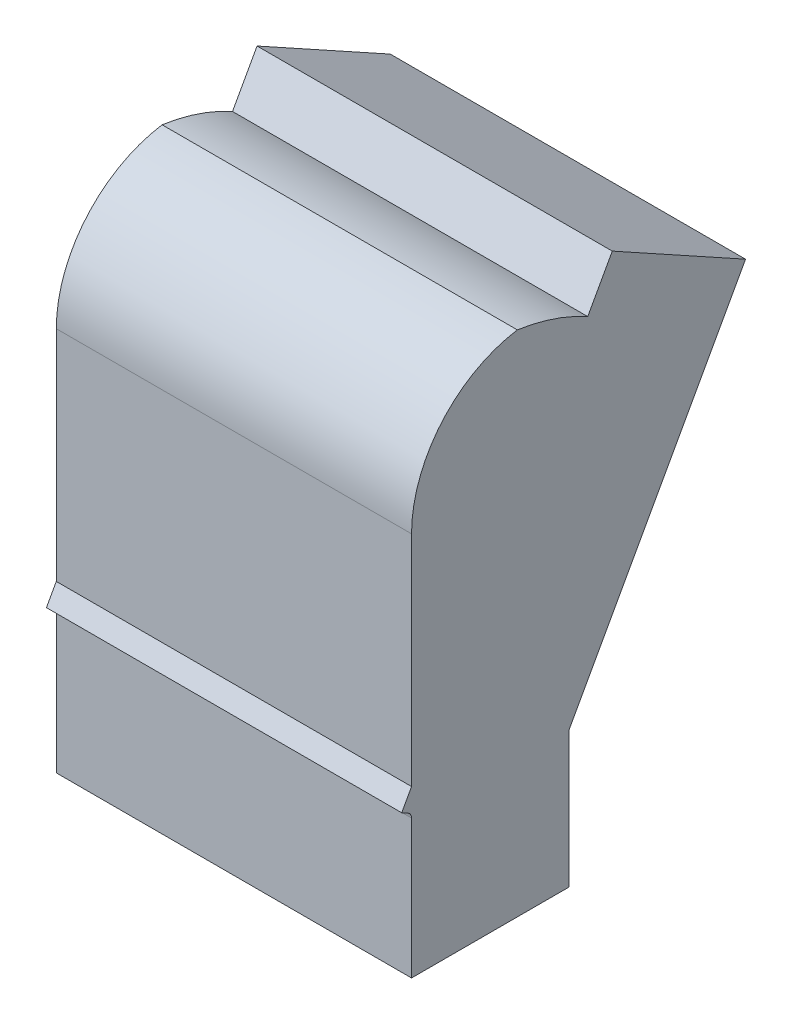
ISO-10303-21;
HEADER;
FILE_DESCRIPTION(('STEP AP214'),'2;1');
FILE_NAME('part.step','',(''),(''),'','','');
FILE_SCHEMA(('AUTOMOTIVE_DESIGN { 1 0 10303 214 1 1 1 1 }'));
ENDSEC;
DATA;
#1=APPLICATION_CONTEXT('core data for automotive mechanical design processes');
#2=APPLICATION_PROTOCOL_DEFINITION('international standard','automotive_design',2000,#1);
#3=PRODUCT_CONTEXT('',#1,'mechanical');
#4=PRODUCT('Part','Part','',(#3));
#5=PRODUCT_RELATED_PRODUCT_CATEGORY('part','',(#4));
#6=PRODUCT_DEFINITION_FORMATION('','',#4);
#7=PRODUCT_DEFINITION_CONTEXT('part definition',#1,'design');
#8=PRODUCT_DEFINITION('design','',#6,#7);
#9=PRODUCT_DEFINITION_SHAPE('','',#8);
#10=(LENGTH_UNIT() NAMED_UNIT(*) SI_UNIT(.MILLI.,.METRE.));
#11=(NAMED_UNIT(*) PLANE_ANGLE_UNIT() SI_UNIT($,.RADIAN.));
#12=(NAMED_UNIT(*) SI_UNIT($,.STERADIAN.) SOLID_ANGLE_UNIT());
#13=UNCERTAINTY_MEASURE_WITH_UNIT(LENGTH_MEASURE(1.E-05),#10,'distance_accuracy_value','');
#14=(GEOMETRIC_REPRESENTATION_CONTEXT(3) GLOBAL_UNCERTAINTY_ASSIGNED_CONTEXT((#13)) GLOBAL_UNIT_ASSIGNED_CONTEXT((#10,
#11,#12)) REPRESENTATION_CONTEXT('',''));
#15=CARTESIAN_POINT('',(0.,0.,0.));
#16=DIRECTION('',(0.,0.,1.));
#17=DIRECTION('',(1.,0.,0.));
#18=AXIS2_PLACEMENT_3D('',#15,#16,#17);
#19=CARTESIAN_POINT('',(177.8,69.342,82.169));
#20=DIRECTION('',(-1.,0.,0.));
#21=DIRECTION('',(0.,0.,1.));
#22=AXIS2_PLACEMENT_3D('',#19,#20,#21);
#23=CYLINDRICAL_SURFACE('',#22,3.429);
#24=CARTESIAN_POINT('',(0.,69.342,82.169));
#25=DIRECTION('',(-1.,0.,0.));
#26=DIRECTION('',(0.,0.,1.));
#27=AXIS2_PLACEMENT_3D('',#24,#25,#26);
#28=CIRCLE('',#27,3.429);
#29=CARTESIAN_POINT('',(0.,72.3433581182661,80.5107206369499));
#30=VERTEX_POINT('',#29);
#31=CARTESIAN_POINT('',(0.,69.342,78.74));
#32=VERTEX_POINT('',#31);
#33=EDGE_CURVE('E149',#30,#32,#28,.T.);
#34=ORIENTED_EDGE('',*,*,#33,.T.);
#35=DIRECTION('',(-1.,0.,0.));
#36=VECTOR('',#35,1.);
#37=CARTESIAN_POINT('',(177.8,69.342,78.74));
#38=LINE('',#37,#36);
#39=CARTESIAN_POINT('',(177.8,69.342,78.74));
#40=VERTEX_POINT('',#39);
#41=EDGE_CURVE('E11',#40,#32,#38,.T.);
#42=ORIENTED_EDGE('',*,*,#41,.F.);
#43=CARTESIAN_POINT('',(177.8,69.342,82.169));
#44=DIRECTION('',(-1.,0.,0.));
#45=DIRECTION('',(0.,0.,1.));
#46=AXIS2_PLACEMENT_3D('',#43,#44,#45);
#47=CIRCLE('',#46,3.429);
#48=CARTESIAN_POINT('',(177.8,72.3433581182661,80.5107206369499));
#49=VERTEX_POINT('',#48);
#50=EDGE_CURVE('E171',#49,#40,#47,.T.);
#51=ORIENTED_EDGE('',*,*,#50,.F.);
#52=DIRECTION('',(-1.,0.,0.));
#53=VECTOR('',#52,1.);
#54=CARTESIAN_POINT('',(177.8,72.3433581182661,80.5107206369499));
#55=LINE('',#54,#53);
#56=EDGE_CURVE('E145',#49,#30,#55,.T.);
#57=ORIENTED_EDGE('',*,*,#56,.T.);
#58=EDGE_LOOP('',(#34,#42,#51,#57));
#59=FACE_BOUND('',#58,.T.);
#60=ADVANCED_FACE('F34',(#59),#23,.F.);
#61=CARTESIAN_POINT('',(177.8,69.342,78.74));
#62=DIRECTION('',(0.,0.,-1.));
#63=DIRECTION('',(-1.,0.,0.));
#64=AXIS2_PLACEMENT_3D('',#61,#62,#63);
#65=PLANE('',#64);
#66=DIRECTION('',(0.,-1.,0.));
#67=VECTOR('',#66,1.);
#68=CARTESIAN_POINT('',(0.,69.342,78.74));
#69=LINE('',#68,#67);
#70=CARTESIAN_POINT('',(0.,0.,78.74));
#71=VERTEX_POINT('',#70);
#72=EDGE_CURVE('E152',#32,#71,#69,.T.);
#73=ORIENTED_EDGE('',*,*,#72,.T.);
#74=DIRECTION('',(-1.,0.,0.));
#75=VECTOR('',#74,1.);
#76=CARTESIAN_POINT('',(177.8,0.,78.74));
#77=LINE('',#76,#75);
#78=CARTESIAN_POINT('',(177.8,0.,78.74));
#79=VERTEX_POINT('',#78);
#80=EDGE_CURVE('E42',#79,#71,#77,.T.);
#81=ORIENTED_EDGE('',*,*,#80,.F.);
#82=DIRECTION('',(0.,-1.,0.));
#83=VECTOR('',#82,1.);
#84=CARTESIAN_POINT('',(177.8,69.342,78.74));
#85=LINE('',#84,#83);
#86=EDGE_CURVE('E100',#40,#79,#85,.T.);
#87=ORIENTED_EDGE('',*,*,#86,.F.);
#88=ORIENTED_EDGE('',*,*,#41,.T.);
#89=EDGE_LOOP('',(#73,#81,#87,#88));
#90=FACE_BOUND('',#89,.T.);
#91=ADVANCED_FACE('F247',(#90),#65,.F.);
#92=CARTESIAN_POINT('',(177.8,0.,0.));
#93=DIRECTION('',(0.,1.,0.));
#94=DIRECTION('',(0.,0.,1.));
#95=AXIS2_PLACEMENT_3D('',#92,#93,#94);
#96=PLANE('',#95);
#97=DIRECTION('',(0.,0.,-1.));
#98=VECTOR('',#97,1.);
#99=CARTESIAN_POINT('',(0.,0.,0.));
#100=LINE('',#99,#98);
#101=CARTESIAN_POINT('',(0.,0.,0.));
#102=VERTEX_POINT('',#101);
#103=EDGE_CURVE('E155',#71,#102,#100,.T.);
#104=ORIENTED_EDGE('',*,*,#103,.T.);
#105=DIRECTION('',(-1.,0.,0.));
#106=VECTOR('',#105,1.);
#107=CARTESIAN_POINT('',(177.8,0.,0.));
#108=LINE('',#107,#106);
#109=CARTESIAN_POINT('',(177.8,0.,0.));
#110=VERTEX_POINT('',#109);
#111=EDGE_CURVE('E187',#110,#102,#108,.T.);
#112=ORIENTED_EDGE('',*,*,#111,.F.);
#113=DIRECTION('',(0.,0.,-1.));
#114=VECTOR('',#113,1.);
#115=CARTESIAN_POINT('',(177.8,0.,0.));
#116=LINE('',#115,#114);
#117=EDGE_CURVE('E195',#79,#110,#116,.T.);
#118=ORIENTED_EDGE('',*,*,#117,.F.);
#119=ORIENTED_EDGE('',*,*,#80,.T.);
#120=EDGE_LOOP('',(#104,#112,#118,#119));
#121=FACE_BOUND('',#120,.T.);
#122=ADVANCED_FACE('F193',(#121),#96,.F.);
#123=CARTESIAN_POINT('',(177.8,67.056,0.));
#124=DIRECTION('',(0.,0.,1.));
#125=DIRECTION('',(1.,0.,0.));
#126=AXIS2_PLACEMENT_3D('',#123,#124,#125);
#127=PLANE('',#126);
#128=DIRECTION('',(0.,1.,0.));
#129=VECTOR('',#128,1.);
#130=CARTESIAN_POINT('',(0.,67.056,0.));
#131=LINE('',#130,#129);
#132=CARTESIAN_POINT('',(0.,67.056,0.));
#133=VERTEX_POINT('',#132);
#134=EDGE_CURVE('E157',#102,#133,#131,.T.);
#135=ORIENTED_EDGE('',*,*,#134,.T.);
#136=DIRECTION('',(-1.,0.,0.));
#137=VECTOR('',#136,1.);
#138=CARTESIAN_POINT('',(177.8,67.056,0.));
#139=LINE('',#138,#137);
#140=CARTESIAN_POINT('',(177.8,67.056,0.));
#141=VERTEX_POINT('',#140);
#142=EDGE_CURVE('E184',#141,#133,#139,.T.);
#143=ORIENTED_EDGE('',*,*,#142,.F.);
#144=DIRECTION('',(0.,1.,0.));
#145=VECTOR('',#144,1.);
#146=CARTESIAN_POINT('',(177.8,67.056,0.));
#147=LINE('',#146,#145);
#148=EDGE_CURVE('E214',#110,#141,#147,.T.);
#149=ORIENTED_EDGE('',*,*,#148,.F.);
#150=ORIENTED_EDGE('',*,*,#111,.T.);
#151=EDGE_LOOP('',(#135,#143,#149,#150));
#152=FACE_BOUND('',#151,.T.);
#153=ADVANCED_FACE('F204',(#152),#127,.F.);
#154=CARTESIAN_POINT('',(177.8,67.0560000000001,-3.42899999999976));
#155=DIRECTION('',(-1.,0.,0.));
#156=DIRECTION('',(0.,0.,1.));
#157=AXIS2_PLACEMENT_3D('',#154,#155,#156);
#158=CYLINDRICAL_SURFACE('',#157,3.42899999999976);
#159=CARTESIAN_POINT('',(0.,67.0560000000001,-3.42899999999976));
#160=DIRECTION('',(-1.,0.,0.));
#161=DIRECTION('',(0.,0.,1.));
#162=AXIS2_PLACEMENT_3D('',#159,#160,#161);
#163=CIRCLE('',#162,3.42899999999976);
#164=CARTESIAN_POINT('',(0.,68.7142793630501,-0.427641881733836));
#165=VERTEX_POINT('',#164);
#166=EDGE_CURVE('E159',#133,#165,#163,.T.);
#167=ORIENTED_EDGE('',*,*,#166,.T.);
#168=DIRECTION('',(-1.,0.,0.));
#169=VECTOR('',#168,1.);
#170=CARTESIAN_POINT('',(177.8,68.7142793630501,-0.427641881733836));
#171=LINE('',#170,#169);
#172=CARTESIAN_POINT('',(177.8,68.7142793630501,-0.427641881733836));
#173=VERTEX_POINT('',#172);
#174=EDGE_CURVE('E181',#173,#165,#171,.T.);
#175=ORIENTED_EDGE('',*,*,#174,.F.);
#176=CARTESIAN_POINT('',(177.8,67.0560000000001,-3.42899999999976));
#177=DIRECTION('',(-1.,0.,0.));
#178=DIRECTION('',(0.,0.,1.));
#179=AXIS2_PLACEMENT_3D('',#176,#177,#178);
#180=CIRCLE('',#179,3.42899999999976);
#181=EDGE_CURVE('E210',#141,#173,#180,.T.);
#182=ORIENTED_EDGE('',*,*,#181,.F.);
#183=ORIENTED_EDGE('',*,*,#142,.T.);
#184=EDGE_LOOP('',(#167,#175,#182,#183));
#185=FACE_BOUND('',#184,.T.);
#186=ADVANCED_FACE('F208',(#185),#158,.F.);
#187=CARTESIAN_POINT('',(177.8,205.754714730598,-76.1438066707208));
#188=DIRECTION('',(0.,0.483604363677484,0.875286706989256));
#189=DIRECTION('',(0.,-0.875286706989256,0.483604363677484));
#190=AXIS2_PLACEMENT_3D('',#187,#188,#189);
#191=PLANE('',#190);
#192=DIRECTION('',(0.,0.875286706989256,-0.483604363677484));
#193=VECTOR('',#192,1.);
#194=CARTESIAN_POINT('',(0.,205.754714730598,-76.1438066707208));
#195=LINE('',#194,#193);
#196=CARTESIAN_POINT('',(0.,227.986997088125,-88.4273575081289));
#197=VERTEX_POINT('',#196);
#198=EDGE_CURVE('E161',#165,#197,#195,.T.);
#199=ORIENTED_EDGE('',*,*,#198,.T.);
#200=DIRECTION('',(1.,0.,0.));
#201=VECTOR('',#200,1.);
#202=CARTESIAN_POINT('',(-98.6341545654625,227.986997088125,-88.4273575081289));
#203=LINE('',#202,#201);
#204=CARTESIAN_POINT('',(177.8,227.986997088125,-88.4273575081289));
#205=VERTEX_POINT('',#204);
#206=EDGE_CURVE('E348',#197,#205,#203,.T.);
#207=ORIENTED_EDGE('',*,*,#206,.T.);
#208=DIRECTION('',(0.,0.875286706989256,-0.483604363677484));
#209=VECTOR('',#208,1.);
#210=CARTESIAN_POINT('',(177.8,205.754714730598,-76.1438066707208));
#211=LINE('',#210,#209);
#212=EDGE_CURVE('E213',#173,#205,#211,.T.);
#213=ORIENTED_EDGE('',*,*,#212,.F.);
#214=ORIENTED_EDGE('',*,*,#174,.T.);
#215=EDGE_LOOP('',(#199,#207,#213,#214));
#216=FACE_BOUND('',#215,.T.);
#217=ADVANCED_FACE('F260',(#216),#191,.F.);
#218=CARTESIAN_POINT('',(177.8,151.982452415155,40.6230765510221));
#219=DIRECTION('',(-1.,0.,0.));
#220=DIRECTION('',(0.,0.,1.));
#221=AXIS2_PLACEMENT_3D('',#218,#219,#220);
#222=CYLINDRICAL_SURFACE('',#221,103.5351206685);
#223=CARTESIAN_POINT('',(0.,151.982452415155,40.6230765510221));
#224=DIRECTION('',(1.,0.,0.));
#225=DIRECTION('',(0.,0.,1.));
#226=AXIS2_PLACEMENT_3D('',#223,#224,#225);
#227=CIRCLE('',#226,103.5351206685);
#228=CARTESIAN_POINT('',(0.,242.605367242822,-9.44695959813943));
#229=VERTEX_POINT('',#228);
#230=CARTESIAN_POINT('',(0.,254.449324625177,25.7886129160984));
#231=VERTEX_POINT('',#230);
#232=EDGE_CURVE('E164',#229,#231,#227,.T.);
#233=ORIENTED_EDGE('',*,*,#232,.T.);
#234=DIRECTION('',(-1.,0.,0.));
#235=VECTOR('',#234,1.);
#236=CARTESIAN_POINT('',(177.8,254.449324625177,25.7886129160984));
#237=LINE('',#236,#235);
#238=CARTESIAN_POINT('',(177.8,254.449324625177,25.7886129160984));
#239=VERTEX_POINT('',#238);
#240=EDGE_CURVE('E175',#239,#231,#237,.T.);
#241=ORIENTED_EDGE('',*,*,#240,.F.);
#242=CARTESIAN_POINT('',(177.8,151.982452415155,40.6230765510221));
#243=DIRECTION('',(1.,0.,0.));
#244=DIRECTION('',(0.,0.,1.));
#245=AXIS2_PLACEMENT_3D('',#242,#243,#244);
#246=CIRCLE('',#245,103.5351206685);
#247=CARTESIAN_POINT('',(177.8,242.605367242822,-9.44695959813943));
#248=VERTEX_POINT('',#247);
#249=EDGE_CURVE('E216',#248,#239,#246,.T.);
#250=ORIENTED_EDGE('',*,*,#249,.F.);
#251=DIRECTION('',(-1.,0.,0.));
#252=VECTOR('',#251,1.);
#253=CARTESIAN_POINT('',(177.8,242.605367242822,-9.44695959813943));
#254=LINE('',#253,#252);
#255=EDGE_CURVE('E178',#248,#229,#254,.T.);
#256=ORIENTED_EDGE('',*,*,#255,.T.);
#257=EDGE_LOOP('',(#233,#241,#250,#256));
#258=FACE_BOUND('',#257,.T.);
#259=ADVANCED_FACE('F228',(#258),#222,.T.);
#260=CARTESIAN_POINT('',(177.8,192.532,16.0636014352988));
#261=DIRECTION('',(-1.,0.,0.));
#262=DIRECTION('',(0.,0.,1.));
#263=AXIS2_PLACEMENT_3D('',#260,#261,#262);
#264=CYLINDRICAL_SURFACE('',#263,62.6763985647012);
#265=CARTESIAN_POINT('',(0.,192.532,16.0636014352988));
#266=DIRECTION('',(1.,0.,0.));
#267=DIRECTION('',(0.,0.,1.));
#268=AXIS2_PLACEMENT_3D('',#265,#266,#267);
#269=CIRCLE('',#268,62.6763985647012);
#270=CARTESIAN_POINT('',(0.,192.532,78.74));
#271=VERTEX_POINT('',#270);
#272=EDGE_CURVE('E166',#231,#271,#269,.T.);
#273=ORIENTED_EDGE('',*,*,#272,.T.);
#274=DIRECTION('',(-1.,0.,0.));
#275=VECTOR('',#274,1.);
#276=CARTESIAN_POINT('',(177.8,192.532,78.74));
#277=LINE('',#276,#275);
#278=CARTESIAN_POINT('',(177.8,192.532,78.74));
#279=VERTEX_POINT('',#278);
#280=EDGE_CURVE('E140',#279,#271,#277,.T.);
#281=ORIENTED_EDGE('',*,*,#280,.F.);
#282=CARTESIAN_POINT('',(177.8,192.532,16.0636014352988));
#283=DIRECTION('',(1.,0.,0.));
#284=DIRECTION('',(0.,0.,1.));
#285=AXIS2_PLACEMENT_3D('',#282,#283,#284);
#286=CIRCLE('',#285,62.6763985647012);
#287=EDGE_CURVE('E131',#239,#279,#286,.T.);
#288=ORIENTED_EDGE('',*,*,#287,.F.);
#289=ORIENTED_EDGE('',*,*,#240,.T.);
#290=EDGE_LOOP('',(#273,#281,#288,#289));
#291=FACE_BOUND('',#290,.T.);
#292=ADVANCED_FACE('F232',(#291),#264,.T.);
#293=CARTESIAN_POINT('',(177.8,82.9937523287611,78.74));
#294=DIRECTION('',(0.,0.,-1.));
#295=DIRECTION('',(-1.,0.,0.));
#296=AXIS2_PLACEMENT_3D('',#293,#294,#295);
#297=PLANE('',#296);
#298=DIRECTION('',(0.,-1.,0.));
#299=VECTOR('',#298,1.);
#300=CARTESIAN_POINT('',(0.,82.9937523287611,78.74));
#301=LINE('',#300,#299);
#302=CARTESIAN_POINT('',(0.,82.9937523287611,78.74));
#303=VERTEX_POINT('',#302);
#304=EDGE_CURVE('E139',#271,#303,#301,.T.);
#305=ORIENTED_EDGE('',*,*,#304,.T.);
#306=DIRECTION('',(-1.,0.,0.));
#307=VECTOR('',#306,1.);
#308=CARTESIAN_POINT('',(177.8,82.9937523287611,78.74));
#309=LINE('',#308,#307);
#310=CARTESIAN_POINT('',(177.8,82.9937523287611,78.74));
#311=VERTEX_POINT('',#310);
#312=EDGE_CURVE('E136',#311,#303,#309,.T.);
#313=ORIENTED_EDGE('',*,*,#312,.F.);
#314=DIRECTION('',(0.,-1.,0.));
#315=VECTOR('',#314,1.);
#316=CARTESIAN_POINT('',(177.8,82.9937523287611,78.74));
#317=LINE('',#316,#315);
#318=EDGE_CURVE('E125',#279,#311,#317,.T.);
#319=ORIENTED_EDGE('',*,*,#318,.F.);
#320=ORIENTED_EDGE('',*,*,#280,.T.);
#321=EDGE_LOOP('',(#305,#313,#319,#320));
#322=FACE_BOUND('',#321,.T.);
#323=ADVANCED_FACE('F137',(#322),#297,.F.);
#324=CARTESIAN_POINT('',(177.8,82.9937523287611,78.74));
#325=DIRECTION('',(0.,-0.483604363677484,-0.875286706989256));
#326=DIRECTION('',(0.,0.875286706989256,-0.483604363677484));
#327=AXIS2_PLACEMENT_3D('',#324,#325,#326);
#328=PLANE('',#327);
#329=DIRECTION('',(0.,-0.875286706989256,0.483604363677484));
#330=VECTOR('',#329,1.);
#331=CARTESIAN_POINT('',(0.,82.9937523287611,78.74));
#332=LINE('',#331,#330);
#333=CARTESIAN_POINT('',(0.,74.0846669727665,83.662355749414));
#334=VERTEX_POINT('',#333);
#335=EDGE_CURVE('E86',#303,#334,#332,.T.);
#336=ORIENTED_EDGE('',*,*,#335,.T.);
#337=DIRECTION('',(-1.,0.,0.));
#338=VECTOR('',#337,1.);
#339=CARTESIAN_POINT('',(177.8,74.0846669727665,83.662355749414));
#340=LINE('',#339,#338);
#341=CARTESIAN_POINT('',(177.8,74.0846669727665,83.662355749414));
#342=VERTEX_POINT('',#341);
#343=EDGE_CURVE('E141',#342,#334,#340,.T.);
#344=ORIENTED_EDGE('',*,*,#343,.F.);
#345=DIRECTION('',(0.,-0.875286706989256,0.483604363677484));
#346=VECTOR('',#345,1.);
#347=CARTESIAN_POINT('',(177.8,82.9937523287611,78.74));
#348=LINE('',#347,#346);
#349=EDGE_CURVE('E129',#311,#342,#348,.T.);
#350=ORIENTED_EDGE('',*,*,#349,.F.);
#351=ORIENTED_EDGE('',*,*,#312,.T.);
#352=EDGE_LOOP('',(#336,#344,#350,#351));
#353=FACE_BOUND('',#352,.T.);
#354=ADVANCED_FACE('F143',(#353),#328,.F.);
#355=CARTESIAN_POINT('',(177.8,74.0846669727665,83.662355749414));
#356=DIRECTION('',(0.,0.875286706989255,-0.483604363677486));
#357=DIRECTION('',(0.,0.483604363677486,0.875286706989255));
#358=AXIS2_PLACEMENT_3D('',#355,#356,#357);
#359=PLANE('',#358);
#360=DIRECTION('',(0.,-0.483604363677486,-0.875286706989255));
#361=VECTOR('',#360,1.);
#362=CARTESIAN_POINT('',(0.,74.0846669727665,83.662355749414));
#363=LINE('',#362,#361);
#364=EDGE_CURVE('E92',#334,#30,#363,.T.);
#365=ORIENTED_EDGE('',*,*,#364,.T.);
#366=ORIENTED_EDGE('',*,*,#56,.F.);
#367=DIRECTION('',(0.,-0.483604363677486,-0.875286706989255));
#368=VECTOR('',#367,1.);
#369=CARTESIAN_POINT('',(177.8,74.0846669727665,83.662355749414));
#370=LINE('',#369,#368);
#371=EDGE_CURVE('E50',#342,#49,#370,.T.);
#372=ORIENTED_EDGE('',*,*,#371,.F.);
#373=ORIENTED_EDGE('',*,*,#343,.T.);
#374=EDGE_LOOP('',(#365,#366,#372,#373));
#375=FACE_BOUND('',#374,.T.);
#376=ADVANCED_FACE('F236',(#375),#359,.F.);
#377=CARTESIAN_POINT('',(177.8,69.342,82.169));
#378=DIRECTION('',(-1.,0.,0.));
#379=DIRECTION('',(0.,0.,1.));
#380=AXIS2_PLACEMENT_3D('',#377,#378,#379);
#381=PLANE('',#380);
#382=ORIENTED_EDGE('',*,*,#50,.T.);
#383=ORIENTED_EDGE('',*,*,#86,.T.);
#384=ORIENTED_EDGE('',*,*,#117,.T.);
#385=ORIENTED_EDGE('',*,*,#148,.T.);
#386=ORIENTED_EDGE('',*,*,#181,.T.);
#387=ORIENTED_EDGE('',*,*,#212,.T.);
#388=DIRECTION('',(0.,0.483604363677484,0.875286706989256));
#389=VECTOR('',#388,1.);
#390=CARTESIAN_POINT('',(177.8,227.986997088125,-88.4273575081289));
#391=LINE('',#390,#389);
#392=CARTESIAN_POINT('',(177.8,264.837649600349,-21.7305104355475));
#393=VERTEX_POINT('',#392);
#394=EDGE_CURVE('E355',#205,#393,#391,.T.);
#395=ORIENTED_EDGE('',*,*,#394,.T.);
#396=DIRECTION('',(0.,-0.875286706989256,0.483604363677483));
#397=VECTOR('',#396,1.);
#398=CARTESIAN_POINT('',(177.8,264.837649600349,-21.7305104355475));
#399=LINE('',#398,#397);
#400=EDGE_CURVE('E225',#393,#248,#399,.T.);
#401=ORIENTED_EDGE('',*,*,#400,.T.);
#402=ORIENTED_EDGE('',*,*,#249,.T.);
#403=ORIENTED_EDGE('',*,*,#287,.T.);
#404=ORIENTED_EDGE('',*,*,#318,.T.);
#405=ORIENTED_EDGE('',*,*,#349,.T.);
#406=ORIENTED_EDGE('',*,*,#371,.T.);
#407=EDGE_LOOP('',(#382,#383,#384,#385,#386,#387,#395,#401,#402,#403,#404,#405,#406));
#408=FACE_BOUND('',#407,.T.);
#409=ADVANCED_FACE('F127',(#408),#381,.F.);
#410=CARTESIAN_POINT('',(0.,69.342,82.169));
#411=DIRECTION('',(-1.,0.,0.));
#412=DIRECTION('',(0.,0.,1.));
#413=AXIS2_PLACEMENT_3D('',#410,#411,#412);
#414=PLANE('',#413);
#415=ORIENTED_EDGE('',*,*,#33,.F.);
#416=ORIENTED_EDGE('',*,*,#364,.F.);
#417=ORIENTED_EDGE('',*,*,#335,.F.);
#418=ORIENTED_EDGE('',*,*,#304,.F.);
#419=ORIENTED_EDGE('',*,*,#272,.F.);
#420=ORIENTED_EDGE('',*,*,#232,.F.);
#421=DIRECTION('',(0.,-0.875286706989257,0.483604363677483));
#422=VECTOR('',#421,1.);
#423=CARTESIAN_POINT('',(0.,264.837649600349,-21.7305104355475));
#424=LINE('',#423,#422);
#425=CARTESIAN_POINT('',(0.,264.837649600349,-21.7305104355475));
#426=VERTEX_POINT('',#425);
#427=EDGE_CURVE('E153',#426,#229,#424,.T.);
#428=ORIENTED_EDGE('',*,*,#427,.F.);
#429=DIRECTION('',(0.,0.483604363677484,0.875286706989256));
#430=VECTOR('',#429,1.);
#431=CARTESIAN_POINT('',(0.,227.986997088125,-88.4273575081289));
#432=LINE('',#431,#430);
#433=EDGE_CURVE('E343',#197,#426,#432,.T.);
#434=ORIENTED_EDGE('',*,*,#433,.F.);
#435=ORIENTED_EDGE('',*,*,#198,.F.);
#436=ORIENTED_EDGE('',*,*,#166,.F.);
#437=ORIENTED_EDGE('',*,*,#134,.F.);
#438=ORIENTED_EDGE('',*,*,#103,.F.);
#439=ORIENTED_EDGE('',*,*,#72,.F.);
#440=EDGE_LOOP('',(#415,#416,#417,#418,#419,#420,#428,#434,#435,#436,#437,#438,#439));
#441=FACE_BOUND('',#440,.T.);
#442=ADVANCED_FACE('F199',(#441),#414,.T.);
#443=CARTESIAN_POINT('',(-98.6341545654625,227.986997088125,-88.4273575081289));
#444=DIRECTION('',(0.,0.875286706989256,-0.483604363677484));
#445=DIRECTION('',(0.,0.483604363677484,0.875286706989256));
#446=AXIS2_PLACEMENT_3D('',#443,#444,#445);
#447=PLANE('',#446);
#448=ORIENTED_EDGE('',*,*,#206,.F.);
#449=ORIENTED_EDGE('',*,*,#433,.T.);
#450=DIRECTION('',(1.,0.,0.));
#451=VECTOR('',#450,1.);
#452=CARTESIAN_POINT('',(-98.6341545654625,264.837649600349,-21.7305104355475));
#453=LINE('',#452,#451);
#454=EDGE_CURVE('E337',#426,#393,#453,.T.);
#455=ORIENTED_EDGE('',*,*,#454,.T.);
#456=ORIENTED_EDGE('',*,*,#394,.F.);
#457=EDGE_LOOP('',(#448,#449,#455,#456));
#458=FACE_BOUND('',#457,.T.);
#459=ADVANCED_FACE('F312',(#458),#447,.T.);
#460=CARTESIAN_POINT('',(-98.6341545654625,264.837649600349,-21.7305104355475));
#461=DIRECTION('',(0.,0.483604363677483,0.875286706989256));
#462=DIRECTION('',(0.,-0.875286706989257,0.483604363677483));
#463=AXIS2_PLACEMENT_3D('',#460,#461,#462);
#464=PLANE('',#463);
#465=ORIENTED_EDGE('',*,*,#454,.F.);
#466=ORIENTED_EDGE('',*,*,#427,.T.);
#467=ORIENTED_EDGE('',*,*,#255,.F.);
#468=ORIENTED_EDGE('',*,*,#400,.F.);
#469=EDGE_LOOP('',(#465,#466,#467,#468));
#470=FACE_BOUND('',#469,.T.);
#471=ADVANCED_FACE('F320',(#470),#464,.T.);
#472=CLOSED_SHELL('',(#60,#91,#122,#153,#186,#217,#259,#292,#323,#354,#376,#409,#442,#459,#471));
#473=MANIFOLD_SOLID_BREP('B2',#472);
#474=ADVANCED_BREP_SHAPE_REPRESENTATION('',(#18,#473),#14);
#475=SHAPE_DEFINITION_REPRESENTATION(#9,#474);
ENDSEC;
END-ISO-10303-21;
